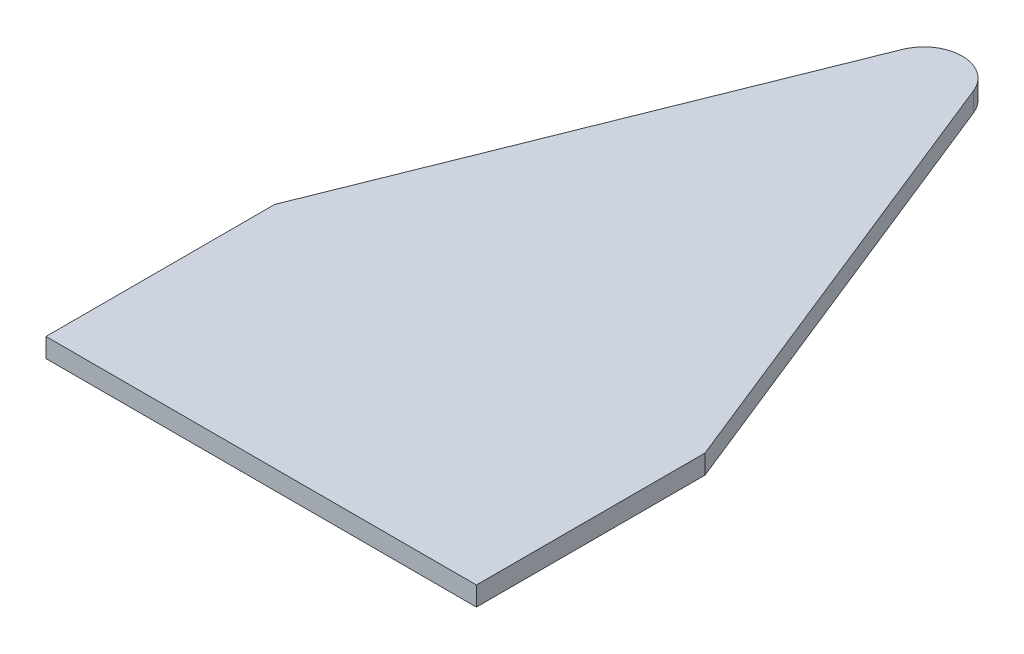
ISO-10303-21;
HEADER;
FILE_DESCRIPTION(('STEP AP214'),'2;1');
FILE_NAME('part.step','',(''),(''),'','','');
FILE_SCHEMA(('AUTOMOTIVE_DESIGN { 1 0 10303 214 1 1 1 1 }'));
ENDSEC;
DATA;
#1=APPLICATION_CONTEXT('core data for automotive mechanical design processes');
#2=APPLICATION_PROTOCOL_DEFINITION('international standard','automotive_design',2000,#1);
#3=PRODUCT_CONTEXT('',#1,'mechanical');
#4=PRODUCT('Part','Part','',(#3));
#5=PRODUCT_RELATED_PRODUCT_CATEGORY('part','',(#4));
#6=PRODUCT_DEFINITION_FORMATION('','',#4);
#7=PRODUCT_DEFINITION_CONTEXT('part definition',#1,'design');
#8=PRODUCT_DEFINITION('design','',#6,#7);
#9=PRODUCT_DEFINITION_SHAPE('','',#8);
#10=(LENGTH_UNIT() NAMED_UNIT(*) SI_UNIT(.MILLI.,.METRE.));
#11=(NAMED_UNIT(*) PLANE_ANGLE_UNIT() SI_UNIT($,.RADIAN.));
#12=(NAMED_UNIT(*) SI_UNIT($,.STERADIAN.) SOLID_ANGLE_UNIT());
#13=UNCERTAINTY_MEASURE_WITH_UNIT(LENGTH_MEASURE(1.E-05),#10,'distance_accuracy_value','');
#14=(GEOMETRIC_REPRESENTATION_CONTEXT(3) GLOBAL_UNCERTAINTY_ASSIGNED_CONTEXT((#13)) GLOBAL_UNIT_ASSIGNED_CONTEXT((#10,
#11,#12)) REPRESENTATION_CONTEXT('',''));
#15=CARTESIAN_POINT('',(0.,0.,0.));
#16=DIRECTION('',(0.,0.,1.));
#17=DIRECTION('',(1.,0.,0.));
#18=AXIS2_PLACEMENT_3D('',#15,#16,#17);
#19=CARTESIAN_POINT('',(71.247,6.35,0.));
#20=DIRECTION('',(-1.,0.,0.));
#21=DIRECTION('',(0.,0.,1.));
#22=AXIS2_PLACEMENT_3D('',#19,#20,#21);
#23=PLANE('',#22);
#24=DIRECTION('',(0.,0.,-1.));
#25=VECTOR('',#24,1.);
#26=CARTESIAN_POINT('',(71.247,0.,0.));
#27=LINE('',#26,#25);
#28=CARTESIAN_POINT('',(71.247,0.,37.846));
#29=VERTEX_POINT('',#28);
#30=CARTESIAN_POINT('',(71.247,0.,-37.846));
#31=VERTEX_POINT('',#30);
#32=EDGE_CURVE('E110',#29,#31,#27,.T.);
#33=ORIENTED_EDGE('',*,*,#32,.T.);
#34=DIRECTION('',(0.,-1.,0.));
#35=VECTOR('',#34,1.);
#36=CARTESIAN_POINT('',(71.247,6.35,-37.846));
#37=LINE('',#36,#35);
#38=CARTESIAN_POINT('',(71.247,6.35,-37.846));
#39=VERTEX_POINT('',#38);
#40=EDGE_CURVE('E92',#39,#31,#37,.T.);
#41=ORIENTED_EDGE('',*,*,#40,.F.);
#42=DIRECTION('',(0.,0.,-1.));
#43=VECTOR('',#42,1.);
#44=CARTESIAN_POINT('',(71.247,6.35,0.));
#45=LINE('',#44,#43);
#46=CARTESIAN_POINT('',(71.247,6.35,37.846));
#47=VERTEX_POINT('',#46);
#48=EDGE_CURVE('E97',#47,#39,#45,.T.);
#49=ORIENTED_EDGE('',*,*,#48,.F.);
#50=DIRECTION('',(0.,-1.,0.));
#51=VECTOR('',#50,1.);
#52=CARTESIAN_POINT('',(71.247,6.35,37.846));
#53=LINE('',#52,#51);
#54=EDGE_CURVE('E122',#47,#29,#53,.T.);
#55=ORIENTED_EDGE('',*,*,#54,.T.);
#56=EDGE_LOOP('',(#33,#41,#49,#55));
#57=FACE_BOUND('',#56,.T.);
#58=ADVANCED_FACE('F39',(#57),#23,.F.);
#59=CARTESIAN_POINT('',(74.4567656429074,6.35,-29.8358896611936));
#60=DIRECTION('',(-0.928247882465808,0.,0.371962187188085));
#61=DIRECTION('',(0.371962187188085,0.,0.928247882465808));
#62=AXIS2_PLACEMENT_3D('',#59,#60,#61);
#63=PLANE('',#62);
#64=DIRECTION('',(-0.371962187188085,0.,-0.928247882465808));
#65=VECTOR('',#64,1.);
#66=CARTESIAN_POINT('',(74.4567656429074,0.,-29.8358896611936));
#67=LINE('',#66,#65);
#68=CARTESIAN_POINT('',(11.7887481073158,0.,-186.226664259818));
#69=VERTEX_POINT('',#68);
#70=EDGE_CURVE('E130',#31,#69,#67,.T.);
#71=ORIENTED_EDGE('',*,*,#70,.T.);
#72=DIRECTION('',(0.,-1.,0.));
#73=VECTOR('',#72,1.);
#74=CARTESIAN_POINT('',(11.7887481073158,6.35,-186.226664259818));
#75=LINE('',#74,#73);
#76=CARTESIAN_POINT('',(11.7887481073158,6.35,-186.226664259818));
#77=VERTEX_POINT('',#76);
#78=EDGE_CURVE('E47',#69,#77,#75,.F.);
#79=ORIENTED_EDGE('',*,*,#78,.T.);
#80=DIRECTION('',(-0.371962187188085,0.,-0.928247882465808));
#81=VECTOR('',#80,1.);
#82=CARTESIAN_POINT('',(74.4567656429074,6.35,-29.8358896611936));
#83=LINE('',#82,#81);
#84=EDGE_CURVE('E88',#39,#77,#83,.T.);
#85=ORIENTED_EDGE('',*,*,#84,.F.);
#86=ORIENTED_EDGE('',*,*,#40,.T.);
#87=EDGE_LOOP('',(#71,#79,#85,#86));
#88=FACE_BOUND('',#87,.T.);
#89=ADVANCED_FACE('F90',(#88),#63,.F.);
#90=CARTESIAN_POINT('',(-74.4567656429074,6.35,-29.8358896611936));
#91=DIRECTION('',(0.928247882465808,0.,0.371962187188085));
#92=DIRECTION('',(0.371962187188085,0.,-0.928247882465808));
#93=AXIS2_PLACEMENT_3D('',#90,#91,#92);
#94=PLANE('',#93);
#95=DIRECTION('',(-0.371962187188085,0.,0.928247882465808));
#96=VECTOR('',#95,1.);
#97=CARTESIAN_POINT('',(-74.4567656429074,6.35,-29.8358896611936));
#98=LINE('',#97,#96);
#99=CARTESIAN_POINT('',(-11.7887481073158,6.35,-186.226664259818));
#100=VERTEX_POINT('',#99);
#101=CARTESIAN_POINT('',(-71.247,6.35,-37.846));
#102=VERTEX_POINT('',#101);
#103=EDGE_CURVE('E96',#100,#102,#98,.T.);
#104=ORIENTED_EDGE('',*,*,#103,.F.);
#105=DIRECTION('',(0.,-1.,0.));
#106=VECTOR('',#105,1.);
#107=CARTESIAN_POINT('',(-11.7887481073158,6.35,-186.226664259818));
#108=LINE('',#107,#106);
#109=CARTESIAN_POINT('',(-11.7887481073158,0.,-186.226664259818));
#110=VERTEX_POINT('',#109);
#111=EDGE_CURVE('E111',#100,#110,#108,.T.);
#112=ORIENTED_EDGE('',*,*,#111,.T.);
#113=DIRECTION('',(-0.371962187188085,0.,0.928247882465808));
#114=VECTOR('',#113,1.);
#115=CARTESIAN_POINT('',(-74.4567656429074,0.,-29.8358896611936));
#116=LINE('',#115,#114);
#117=CARTESIAN_POINT('',(-71.247,0.,-37.846));
#118=VERTEX_POINT('',#117);
#119=EDGE_CURVE('E128',#110,#118,#116,.T.);
#120=ORIENTED_EDGE('',*,*,#119,.T.);
#121=DIRECTION('',(0.,-1.,0.));
#122=VECTOR('',#121,1.);
#123=CARTESIAN_POINT('',(-71.247,6.35,-37.846));
#124=LINE('',#123,#122);
#125=EDGE_CURVE('E112',#102,#118,#124,.T.);
#126=ORIENTED_EDGE('',*,*,#125,.F.);
#127=EDGE_LOOP('',(#104,#112,#120,#126));
#128=FACE_BOUND('',#127,.T.);
#129=ADVANCED_FACE('F141',(#128),#94,.F.);
#130=CARTESIAN_POINT('',(-71.247,6.35,0.));
#131=DIRECTION('',(-1.,0.,0.));
#132=DIRECTION('',(0.,0.,1.));
#133=AXIS2_PLACEMENT_3D('',#130,#131,#132);
#134=PLANE('',#133);
#135=DIRECTION('',(0.,0.,-1.));
#136=VECTOR('',#135,1.);
#137=CARTESIAN_POINT('',(-71.247,0.,0.));
#138=LINE('',#137,#136);
#139=CARTESIAN_POINT('',(-71.247,0.,37.846));
#140=VERTEX_POINT('',#139);
#141=EDGE_CURVE('E125',#140,#118,#138,.T.);
#142=ORIENTED_EDGE('',*,*,#141,.F.);
#143=DIRECTION('',(0.,-1.,0.));
#144=VECTOR('',#143,1.);
#145=CARTESIAN_POINT('',(-71.247,6.35,37.846));
#146=LINE('',#145,#144);
#147=CARTESIAN_POINT('',(-71.247,6.35,37.846));
#148=VERTEX_POINT('',#147);
#149=EDGE_CURVE('E117',#148,#140,#146,.T.);
#150=ORIENTED_EDGE('',*,*,#149,.F.);
#151=DIRECTION('',(0.,0.,-1.));
#152=VECTOR('',#151,1.);
#153=CARTESIAN_POINT('',(-71.247,6.35,0.));
#154=LINE('',#153,#152);
#155=EDGE_CURVE('E134',#148,#102,#154,.T.);
#156=ORIENTED_EDGE('',*,*,#155,.T.);
#157=ORIENTED_EDGE('',*,*,#125,.T.);
#158=EDGE_LOOP('',(#142,#150,#156,#157));
#159=FACE_BOUND('',#158,.T.);
#160=ADVANCED_FACE('F144',(#159),#134,.T.);
#161=CARTESIAN_POINT('',(0.,6.35,37.846));
#162=DIRECTION('',(0.,0.,-1.));
#163=DIRECTION('',(-1.,0.,0.));
#164=AXIS2_PLACEMENT_3D('',#161,#162,#163);
#165=PLANE('',#164);
#166=DIRECTION('',(1.,0.,0.));
#167=VECTOR('',#166,1.);
#168=CARTESIAN_POINT('',(0.,0.,37.846));
#169=LINE('',#168,#167);
#170=EDGE_CURVE('E107',#140,#29,#169,.T.);
#171=ORIENTED_EDGE('',*,*,#170,.T.);
#172=ORIENTED_EDGE('',*,*,#54,.F.);
#173=DIRECTION('',(1.,0.,0.));
#174=VECTOR('',#173,1.);
#175=CARTESIAN_POINT('',(0.,6.35,37.846));
#176=LINE('',#175,#174);
#177=EDGE_CURVE('E103',#148,#47,#176,.T.);
#178=ORIENTED_EDGE('',*,*,#177,.F.);
#179=ORIENTED_EDGE('',*,*,#149,.T.);
#180=EDGE_LOOP('',(#171,#172,#178,#179));
#181=FACE_BOUND('',#180,.T.);
#182=ADVANCED_FACE('F147',(#181),#165,.F.);
#183=CARTESIAN_POINT('',(0.,6.35,0.));
#184=DIRECTION('',(0.,1.,0.));
#185=DIRECTION('',(0.,0.,1.));
#186=AXIS2_PLACEMENT_3D('',#183,#184,#185);
#187=PLANE('',#186);
#188=ORIENTED_EDGE('',*,*,#84,.T.);
#189=CARTESIAN_POINT('',(0.,6.35,-181.502744482529));
#190=DIRECTION('',(0.,1.,0.));
#191=DIRECTION('',(0.,0.,1.));
#192=AXIS2_PLACEMENT_3D('',#189,#190,#191);
#193=CIRCLE('',#192,12.7);
#194=EDGE_CURVE('E11',#77,#100,#193,.T.);
#195=ORIENTED_EDGE('',*,*,#194,.T.);
#196=ORIENTED_EDGE('',*,*,#103,.T.);
#197=ORIENTED_EDGE('',*,*,#155,.F.);
#198=ORIENTED_EDGE('',*,*,#177,.T.);
#199=ORIENTED_EDGE('',*,*,#48,.T.);
#200=EDGE_LOOP('',(#188,#195,#196,#197,#198,#199));
#201=FACE_BOUND('',#200,.T.);
#202=ADVANCED_FACE('F100',(#201),#187,.T.);
#203=CARTESIAN_POINT('',(0.,0.,0.));
#204=DIRECTION('',(0.,1.,0.));
#205=DIRECTION('',(0.,0.,1.));
#206=AXIS2_PLACEMENT_3D('',#203,#204,#205);
#207=PLANE('',#206);
#208=ORIENTED_EDGE('',*,*,#119,.F.);
#209=CARTESIAN_POINT('',(0.,0.,-181.502744482529));
#210=DIRECTION('',(0.,1.,0.));
#211=DIRECTION('',(0.,0.,1.));
#212=AXIS2_PLACEMENT_3D('',#209,#210,#211);
#213=CIRCLE('',#212,12.7);
#214=EDGE_CURVE('E61',#110,#69,#213,.F.);
#215=ORIENTED_EDGE('',*,*,#214,.T.);
#216=ORIENTED_EDGE('',*,*,#70,.F.);
#217=ORIENTED_EDGE('',*,*,#32,.F.);
#218=ORIENTED_EDGE('',*,*,#170,.F.);
#219=ORIENTED_EDGE('',*,*,#141,.T.);
#220=EDGE_LOOP('',(#208,#215,#216,#217,#218,#219));
#221=FACE_BOUND('',#220,.T.);
#222=ADVANCED_FACE('F148',(#221),#207,.F.);
#223=CARTESIAN_POINT('',(0.,6.35,-181.502744482529));
#224=DIRECTION('',(0.,-1.,0.));
#225=DIRECTION('',(0.,0.,-1.));
#226=AXIS2_PLACEMENT_3D('',#223,#224,#225);
#227=CYLINDRICAL_SURFACE('',#226,12.7);
#228=ORIENTED_EDGE('',*,*,#194,.F.);
#229=ORIENTED_EDGE('',*,*,#78,.F.);
#230=ORIENTED_EDGE('',*,*,#214,.F.);
#231=ORIENTED_EDGE('',*,*,#111,.F.);
#232=EDGE_LOOP('',(#228,#229,#230,#231));
#233=FACE_BOUND('',#232,.T.);
#234=ADVANCED_FACE('F41',(#233),#227,.T.);
#235=CLOSED_SHELL('',(#58,#89,#129,#160,#182,#202,#222,#234));
#236=MANIFOLD_SOLID_BREP('B2',#235);
#237=ADVANCED_BREP_SHAPE_REPRESENTATION('',(#18,#236),#14);
#238=SHAPE_DEFINITION_REPRESENTATION(#9,#237);
ENDSEC;
END-ISO-10303-21;
